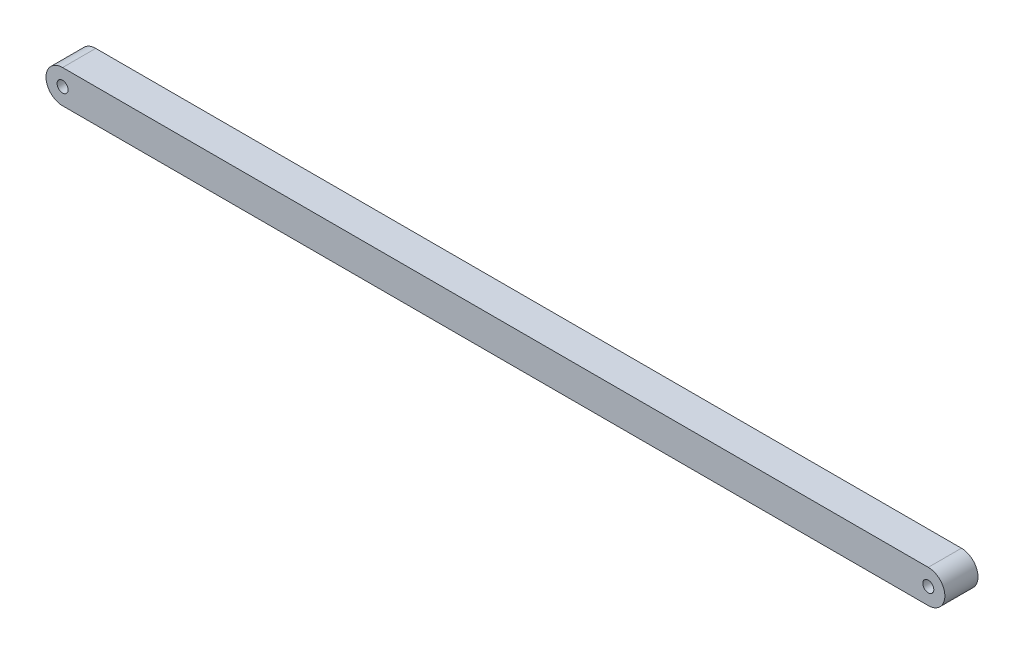
ISO-10303-21;
HEADER;
FILE_DESCRIPTION(('STEP AP214'),'2;1');
FILE_NAME('part.step','',(''),(''),'','','');
FILE_SCHEMA(('AUTOMOTIVE_DESIGN { 1 0 10303 214 1 1 1 1 }'));
ENDSEC;
DATA;
#1=APPLICATION_CONTEXT('core data for automotive mechanical design processes');
#2=APPLICATION_PROTOCOL_DEFINITION('international standard','automotive_design',2000,#1);
#3=PRODUCT_CONTEXT('',#1,'mechanical');
#4=PRODUCT('Part','Part','',(#3));
#5=PRODUCT_RELATED_PRODUCT_CATEGORY('part','',(#4));
#6=PRODUCT_DEFINITION_FORMATION('','',#4);
#7=PRODUCT_DEFINITION_CONTEXT('part definition',#1,'design');
#8=PRODUCT_DEFINITION('design','',#6,#7);
#9=PRODUCT_DEFINITION_SHAPE('','',#8);
#10=(LENGTH_UNIT() NAMED_UNIT(*) SI_UNIT(.MILLI.,.METRE.));
#11=(NAMED_UNIT(*) PLANE_ANGLE_UNIT() SI_UNIT($,.RADIAN.));
#12=(NAMED_UNIT(*) SI_UNIT($,.STERADIAN.) SOLID_ANGLE_UNIT());
#13=UNCERTAINTY_MEASURE_WITH_UNIT(LENGTH_MEASURE(1.E-05),#10,'distance_accuracy_value','');
#14=(GEOMETRIC_REPRESENTATION_CONTEXT(3) GLOBAL_UNCERTAINTY_ASSIGNED_CONTEXT((#13)) GLOBAL_UNIT_ASSIGNED_CONTEXT((#10,
#11,#12)) REPRESENTATION_CONTEXT('',''));
#15=CARTESIAN_POINT('',(0.,0.,0.));
#16=DIRECTION('',(0.,0.,1.));
#17=DIRECTION('',(1.,0.,0.));
#18=AXIS2_PLACEMENT_3D('',#15,#16,#17);
#19=CARTESIAN_POINT('',(0.,0.,9.));
#20=DIRECTION('',(0.,0.,1.));
#21=DIRECTION('',(1.,0.,0.));
#22=AXIS2_PLACEMENT_3D('',#19,#20,#21);
#23=PLANE('',#22);
#24=CARTESIAN_POINT('',(0.,0.,9.));
#25=DIRECTION('',(0.,0.,1.));
#26=DIRECTION('',(1.,0.,0.));
#27=AXIS2_PLACEMENT_3D('',#24,#25,#26);
#28=CIRCLE('',#27,1.5);
#29=CARTESIAN_POINT('',(1.5,0.,9.));
#30=VERTEX_POINT('',#29);
#31=EDGE_CURVE('E112',#30,#30,#28,.T.);
#32=ORIENTED_EDGE('',*,*,#31,.F.);
#33=EDGE_LOOP('',(#32));
#34=FACE_BOUND('',#33,.T.);
#35=CARTESIAN_POINT('',(0.,0.,9.));
#36=DIRECTION('',(0.,0.,1.));
#37=DIRECTION('',(1.,0.,0.));
#38=AXIS2_PLACEMENT_3D('',#35,#36,#37);
#39=CIRCLE('',#38,4.5);
#40=CARTESIAN_POINT('',(0.,4.5,9.));
#41=VERTEX_POINT('',#40);
#42=CARTESIAN_POINT('',(0.,-4.5,9.));
#43=VERTEX_POINT('',#42);
#44=EDGE_CURVE('E92',#41,#43,#39,.T.);
#45=ORIENTED_EDGE('',*,*,#44,.T.);
#46=DIRECTION('',(1.,0.,0.));
#47=VECTOR('',#46,1.);
#48=CARTESIAN_POINT('',(0.,-4.5,9.));
#49=LINE('',#48,#47);
#50=CARTESIAN_POINT('',(235.,-4.5,9.));
#51=VERTEX_POINT('',#50);
#52=EDGE_CURVE('E87',#43,#51,#49,.T.);
#53=ORIENTED_EDGE('',*,*,#52,.T.);
#54=CARTESIAN_POINT('',(235.,0.,9.));
#55=DIRECTION('',(0.,0.,1.));
#56=DIRECTION('',(1.,0.,0.));
#57=AXIS2_PLACEMENT_3D('',#54,#55,#56);
#58=CIRCLE('',#57,4.5);
#59=CARTESIAN_POINT('',(235.,4.5,9.));
#60=VERTEX_POINT('',#59);
#61=EDGE_CURVE('E90',#51,#60,#58,.T.);
#62=ORIENTED_EDGE('',*,*,#61,.T.);
#63=DIRECTION('',(-1.,0.,0.));
#64=VECTOR('',#63,1.);
#65=CARTESIAN_POINT('',(0.,4.5,9.));
#66=LINE('',#65,#64);
#67=EDGE_CURVE('E57',#60,#41,#66,.T.);
#68=ORIENTED_EDGE('',*,*,#67,.T.);
#69=EDGE_LOOP('',(#45,#53,#62,#68));
#70=FACE_BOUND('',#69,.T.);
#71=CARTESIAN_POINT('',(235.,0.,9.));
#72=DIRECTION('',(0.,0.,1.));
#73=DIRECTION('',(1.,0.,0.));
#74=AXIS2_PLACEMENT_3D('',#71,#72,#73);
#75=CIRCLE('',#74,1.50000000000003);
#76=CARTESIAN_POINT('',(236.5,0.,9.));
#77=VERTEX_POINT('',#76);
#78=EDGE_CURVE('E134',#77,#77,#75,.T.);
#79=ORIENTED_EDGE('',*,*,#78,.F.);
#80=EDGE_LOOP('',(#79));
#81=FACE_BOUND('',#80,.T.);
#82=ADVANCED_FACE('F39',(#34,#70,#81),#23,.T.);
#83=CARTESIAN_POINT('',(0.,0.,0.));
#84=DIRECTION('',(0.,0.,1.));
#85=DIRECTION('',(1.,0.,0.));
#86=AXIS2_PLACEMENT_3D('',#83,#84,#85);
#87=PLANE('',#86);
#88=CARTESIAN_POINT('',(0.,0.,0.));
#89=DIRECTION('',(0.,0.,1.));
#90=DIRECTION('',(1.,0.,0.));
#91=AXIS2_PLACEMENT_3D('',#88,#89,#90);
#92=CIRCLE('',#91,4.5);
#93=CARTESIAN_POINT('',(0.,4.5,0.));
#94=VERTEX_POINT('',#93);
#95=CARTESIAN_POINT('',(0.,-4.5,0.));
#96=VERTEX_POINT('',#95);
#97=EDGE_CURVE('E108',#94,#96,#92,.T.);
#98=ORIENTED_EDGE('',*,*,#97,.F.);
#99=DIRECTION('',(-1.,0.,0.));
#100=VECTOR('',#99,1.);
#101=CARTESIAN_POINT('',(0.,4.5,0.));
#102=LINE('',#101,#100);
#103=CARTESIAN_POINT('',(235.,4.5,0.));
#104=VERTEX_POINT('',#103);
#105=EDGE_CURVE('E80',#104,#94,#102,.T.);
#106=ORIENTED_EDGE('',*,*,#105,.F.);
#107=CARTESIAN_POINT('',(235.,0.,0.));
#108=DIRECTION('',(0.,0.,1.));
#109=DIRECTION('',(1.,0.,0.));
#110=AXIS2_PLACEMENT_3D('',#107,#108,#109);
#111=CIRCLE('',#110,4.5);
#112=CARTESIAN_POINT('',(235.,-4.5,0.));
#113=VERTEX_POINT('',#112);
#114=EDGE_CURVE('E74',#113,#104,#111,.T.);
#115=ORIENTED_EDGE('',*,*,#114,.F.);
#116=DIRECTION('',(1.,0.,0.));
#117=VECTOR('',#116,1.);
#118=CARTESIAN_POINT('',(0.,-4.5,0.));
#119=LINE('',#118,#117);
#120=EDGE_CURVE('E97',#96,#113,#119,.T.);
#121=ORIENTED_EDGE('',*,*,#120,.F.);
#122=EDGE_LOOP('',(#98,#106,#115,#121));
#123=FACE_BOUND('',#122,.T.);
#124=CARTESIAN_POINT('',(0.,0.,0.));
#125=DIRECTION('',(0.,0.,1.));
#126=DIRECTION('',(1.,0.,0.));
#127=AXIS2_PLACEMENT_3D('',#124,#125,#126);
#128=CIRCLE('',#127,1.5);
#129=CARTESIAN_POINT('',(1.5,0.,0.));
#130=VERTEX_POINT('',#129);
#131=EDGE_CURVE('E130',#130,#130,#128,.T.);
#132=ORIENTED_EDGE('',*,*,#131,.T.);
#133=EDGE_LOOP('',(#132));
#134=FACE_BOUND('',#133,.T.);
#135=CARTESIAN_POINT('',(235.,0.,0.));
#136=DIRECTION('',(0.,0.,1.));
#137=DIRECTION('',(1.,0.,0.));
#138=AXIS2_PLACEMENT_3D('',#135,#136,#137);
#139=CIRCLE('',#138,1.50000000000003);
#140=CARTESIAN_POINT('',(236.5,0.,0.));
#141=VERTEX_POINT('',#140);
#142=EDGE_CURVE('E138',#141,#141,#139,.T.);
#143=ORIENTED_EDGE('',*,*,#142,.T.);
#144=EDGE_LOOP('',(#143));
#145=FACE_BOUND('',#144,.T.);
#146=ADVANCED_FACE('F125',(#123,#134,#145),#87,.F.);
#147=CARTESIAN_POINT('',(0.,0.,9.));
#148=DIRECTION('',(0.,0.,-1.));
#149=DIRECTION('',(-1.,0.,0.));
#150=AXIS2_PLACEMENT_3D('',#147,#148,#149);
#151=CYLINDRICAL_SURFACE('',#150,4.5);
#152=ORIENTED_EDGE('',*,*,#97,.T.);
#153=DIRECTION('',(0.,0.,-1.));
#154=VECTOR('',#153,1.);
#155=CARTESIAN_POINT('',(0.,-4.5,9.));
#156=LINE('',#155,#154);
#157=EDGE_CURVE('E11',#43,#96,#156,.T.);
#158=ORIENTED_EDGE('',*,*,#157,.F.);
#159=ORIENTED_EDGE('',*,*,#44,.F.);
#160=DIRECTION('',(0.,0.,-1.));
#161=VECTOR('',#160,1.);
#162=CARTESIAN_POINT('',(0.,4.5,9.));
#163=LINE('',#162,#161);
#164=EDGE_CURVE('E104',#41,#94,#163,.T.);
#165=ORIENTED_EDGE('',*,*,#164,.T.);
#166=EDGE_LOOP('',(#152,#158,#159,#165));
#167=FACE_BOUND('',#166,.T.);
#168=ADVANCED_FACE('F41',(#167),#151,.T.);
#169=CARTESIAN_POINT('',(0.,-4.5,9.));
#170=DIRECTION('',(0.,1.,0.));
#171=DIRECTION('',(0.,0.,1.));
#172=AXIS2_PLACEMENT_3D('',#169,#170,#171);
#173=PLANE('',#172);
#174=ORIENTED_EDGE('',*,*,#120,.T.);
#175=DIRECTION('',(0.,0.,-1.));
#176=VECTOR('',#175,1.);
#177=CARTESIAN_POINT('',(235.,-4.5,9.));
#178=LINE('',#177,#176);
#179=EDGE_CURVE('E49',#51,#113,#178,.T.);
#180=ORIENTED_EDGE('',*,*,#179,.F.);
#181=ORIENTED_EDGE('',*,*,#52,.F.);
#182=ORIENTED_EDGE('',*,*,#157,.T.);
#183=EDGE_LOOP('',(#174,#180,#181,#182));
#184=FACE_BOUND('',#183,.T.);
#185=ADVANCED_FACE('F96',(#184),#173,.F.);
#186=CARTESIAN_POINT('',(235.,0.,9.));
#187=DIRECTION('',(0.,0.,-1.));
#188=DIRECTION('',(-1.,0.,0.));
#189=AXIS2_PLACEMENT_3D('',#186,#187,#188);
#190=CYLINDRICAL_SURFACE('',#189,4.5);
#191=ORIENTED_EDGE('',*,*,#114,.T.);
#192=DIRECTION('',(0.,0.,-1.));
#193=VECTOR('',#192,1.);
#194=CARTESIAN_POINT('',(235.,4.5,9.));
#195=LINE('',#194,#193);
#196=EDGE_CURVE('E99',#60,#104,#195,.T.);
#197=ORIENTED_EDGE('',*,*,#196,.F.);
#198=ORIENTED_EDGE('',*,*,#61,.F.);
#199=ORIENTED_EDGE('',*,*,#179,.T.);
#200=EDGE_LOOP('',(#191,#197,#198,#199));
#201=FACE_BOUND('',#200,.T.);
#202=ADVANCED_FACE('F100',(#201),#190,.T.);
#203=CARTESIAN_POINT('',(0.,4.5,9.));
#204=DIRECTION('',(0.,-1.,0.));
#205=DIRECTION('',(0.,0.,-1.));
#206=AXIS2_PLACEMENT_3D('',#203,#204,#205);
#207=PLANE('',#206);
#208=ORIENTED_EDGE('',*,*,#105,.T.);
#209=ORIENTED_EDGE('',*,*,#164,.F.);
#210=ORIENTED_EDGE('',*,*,#67,.F.);
#211=ORIENTED_EDGE('',*,*,#196,.T.);
#212=EDGE_LOOP('',(#208,#209,#210,#211));
#213=FACE_BOUND('',#212,.T.);
#214=ADVANCED_FACE('F122',(#213),#207,.F.);
#215=CARTESIAN_POINT('',(0.,0.,9.));
#216=DIRECTION('',(0.,0.,-1.));
#217=DIRECTION('',(-1.,0.,0.));
#218=AXIS2_PLACEMENT_3D('',#215,#216,#217);
#219=CYLINDRICAL_SURFACE('',#218,1.5);
#220=ORIENTED_EDGE('',*,*,#31,.T.);
#221=EDGE_LOOP('',(#220));
#222=FACE_BOUND('',#221,.T.);
#223=ORIENTED_EDGE('',*,*,#131,.F.);
#224=EDGE_LOOP('',(#223));
#225=FACE_BOUND('',#224,.T.);
#226=ADVANCED_FACE('F157',(#222,#225),#219,.F.);
#227=CARTESIAN_POINT('',(235.,0.,9.));
#228=DIRECTION('',(0.,0.,-1.));
#229=DIRECTION('',(-1.,0.,0.));
#230=AXIS2_PLACEMENT_3D('',#227,#228,#229);
#231=CYLINDRICAL_SURFACE('',#230,1.50000000000003);
#232=ORIENTED_EDGE('',*,*,#78,.T.);
#233=EDGE_LOOP('',(#232));
#234=FACE_BOUND('',#233,.T.);
#235=ORIENTED_EDGE('',*,*,#142,.F.);
#236=EDGE_LOOP('',(#235));
#237=FACE_BOUND('',#236,.T.);
#238=ADVANCED_FACE('F146',(#234,#237),#231,.F.);
#239=CLOSED_SHELL('',(#82,#146,#168,#185,#202,#214,#226,#238));
#240=MANIFOLD_SOLID_BREP('B2',#239);
#241=ADVANCED_BREP_SHAPE_REPRESENTATION('',(#18,#240),#14);
#242=SHAPE_DEFINITION_REPRESENTATION(#9,#241);
ENDSEC;
END-ISO-10303-21;
